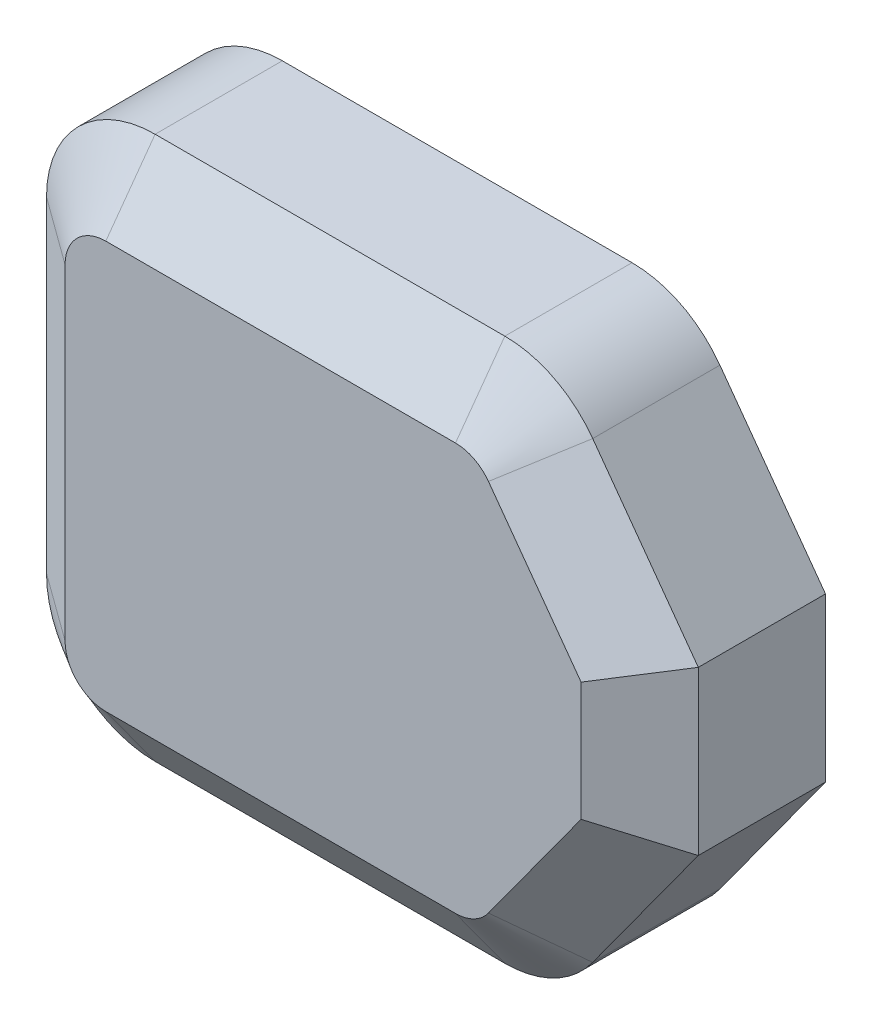
ISO-10303-21;
HEADER;
FILE_DESCRIPTION(('STEP AP214'),'2;1');
FILE_NAME('part.step','',(''),(''),'','','');
FILE_SCHEMA(('AUTOMOTIVE_DESIGN { 1 0 10303 214 1 1 1 1 }'));
ENDSEC;
DATA;
#1=APPLICATION_CONTEXT('core data for automotive mechanical design processes');
#2=APPLICATION_PROTOCOL_DEFINITION('international standard','automotive_design',2000,#1);
#3=PRODUCT_CONTEXT('',#1,'mechanical');
#4=PRODUCT('Part','Part','',(#3));
#5=PRODUCT_RELATED_PRODUCT_CATEGORY('part','',(#4));
#6=PRODUCT_DEFINITION_FORMATION('','',#4);
#7=PRODUCT_DEFINITION_CONTEXT('part definition',#1,'design');
#8=PRODUCT_DEFINITION('design','',#6,#7);
#9=PRODUCT_DEFINITION_SHAPE('','',#8);
#10=(LENGTH_UNIT() NAMED_UNIT(*) SI_UNIT(.MILLI.,.METRE.));
#11=(NAMED_UNIT(*) PLANE_ANGLE_UNIT() SI_UNIT($,.RADIAN.));
#12=(NAMED_UNIT(*) SI_UNIT($,.STERADIAN.) SOLID_ANGLE_UNIT());
#13=UNCERTAINTY_MEASURE_WITH_UNIT(LENGTH_MEASURE(1.E-05),#10,'distance_accuracy_value','');
#14=(GEOMETRIC_REPRESENTATION_CONTEXT(3) GLOBAL_UNCERTAINTY_ASSIGNED_CONTEXT((#13)) GLOBAL_UNIT_ASSIGNED_CONTEXT((#10,
#11,#12)) REPRESENTATION_CONTEXT('',''));
#15=CARTESIAN_POINT('',(0.,0.,0.));
#16=DIRECTION('',(0.,0.,1.));
#17=DIRECTION('',(1.,0.,0.));
#18=AXIS2_PLACEMENT_3D('',#15,#16,#17);
#19=CARTESIAN_POINT('',(0.,0.,13.));
#20=DIRECTION('',(1.,0.,0.));
#21=DIRECTION('',(0.,0.,-1.));
#22=AXIS2_PLACEMENT_3D('',#19,#20,#21);
#23=PLANE('',#22);
#24=DIRECTION('',(0.,0.,-1.));
#25=VECTOR('',#24,1.);
#26=CARTESIAN_POINT('',(0.,8.,13.));
#27=LINE('',#26,#25);
#28=CARTESIAN_POINT('',(0.,8.,0.));
#29=VERTEX_POINT('',#28);
#30=CARTESIAN_POINT('',(0.,8.,9.3672873599732));
#31=VERTEX_POINT('',#30);
#32=EDGE_CURVE('E160',#29,#31,#27,.F.);
#33=ORIENTED_EDGE('',*,*,#32,.T.);
#34=DIRECTION('',(0.,1.,0.));
#35=VECTOR('',#34,1.);
#36=CARTESIAN_POINT('',(0.,0.,9.3672873599732));
#37=LINE('',#36,#35);
#38=CARTESIAN_POINT('',(0.,32.,9.3672873599732));
#39=VERTEX_POINT('',#38);
#40=EDGE_CURVE('E236',#31,#39,#37,.T.);
#41=ORIENTED_EDGE('',*,*,#40,.T.);
#42=DIRECTION('',(0.,0.,-1.));
#43=VECTOR('',#42,1.);
#44=CARTESIAN_POINT('',(0.,32.,13.));
#45=LINE('',#44,#43);
#46=CARTESIAN_POINT('',(0.,32.,0.));
#47=VERTEX_POINT('',#46);
#48=EDGE_CURVE('E164',#39,#47,#45,.T.);
#49=ORIENTED_EDGE('',*,*,#48,.T.);
#50=DIRECTION('',(0.,-1.,0.));
#51=VECTOR('',#50,1.);
#52=CARTESIAN_POINT('',(0.,0.,0.));
#53=LINE('',#52,#51);
#54=EDGE_CURVE('E172',#47,#29,#53,.T.);
#55=ORIENTED_EDGE('',*,*,#54,.T.);
#56=EDGE_LOOP('',(#33,#41,#49,#55));
#57=FACE_BOUND('',#56,.T.);
#58=ADVANCED_FACE('F33',(#57),#23,.F.);
#59=CARTESIAN_POINT('',(0.,0.,13.));
#60=DIRECTION('',(0.,1.,0.));
#61=DIRECTION('',(0.,0.,1.));
#62=AXIS2_PLACEMENT_3D('',#59,#60,#61);
#63=PLANE('',#62);
#64=DIRECTION('',(0.,0.,-1.));
#65=VECTOR('',#64,1.);
#66=CARTESIAN_POINT('',(33.7522010119695,0.,13.));
#67=LINE('',#66,#65);
#68=CARTESIAN_POINT('',(33.7522010119695,0.,0.));
#69=VERTEX_POINT('',#68);
#70=CARTESIAN_POINT('',(33.7522010119695,0.,9.3672873599732));
#71=VERTEX_POINT('',#70);
#72=EDGE_CURVE('E201',#69,#71,#67,.F.);
#73=ORIENTED_EDGE('',*,*,#72,.T.);
#74=DIRECTION('',(-1.,0.,0.));
#75=VECTOR('',#74,1.);
#76=CARTESIAN_POINT('',(0.,0.,9.3672873599732));
#77=LINE('',#76,#75);
#78=CARTESIAN_POINT('',(8.,0.,9.3672873599732));
#79=VERTEX_POINT('',#78);
#80=EDGE_CURVE('E150',#71,#79,#77,.T.);
#81=ORIENTED_EDGE('',*,*,#80,.T.);
#82=DIRECTION('',(0.,0.,-1.));
#83=VECTOR('',#82,1.);
#84=CARTESIAN_POINT('',(8.,0.,13.));
#85=LINE('',#84,#83);
#86=CARTESIAN_POINT('',(8.,0.,0.));
#87=VERTEX_POINT('',#86);
#88=EDGE_CURVE('E142',#79,#87,#85,.T.);
#89=ORIENTED_EDGE('',*,*,#88,.T.);
#90=DIRECTION('',(1.,0.,0.));
#91=VECTOR('',#90,1.);
#92=CARTESIAN_POINT('',(0.,0.,0.));
#93=LINE('',#92,#91);
#94=EDGE_CURVE('E147',#87,#69,#93,.T.);
#95=ORIENTED_EDGE('',*,*,#94,.T.);
#96=EDGE_LOOP('',(#73,#81,#89,#95));
#97=FACE_BOUND('',#96,.T.);
#98=ADVANCED_FACE('F145',(#97),#63,.F.);
#99=CARTESIAN_POINT('',(48.,0.,13.));
#100=DIRECTION('',(-1.,0.,0.));
#101=DIRECTION('',(0.,0.,1.));
#102=AXIS2_PLACEMENT_3D('',#99,#100,#101);
#103=PLANE('',#102);
#104=DIRECTION('',(0.,0.,1.));
#105=VECTOR('',#104,1.);
#106=CARTESIAN_POINT('',(48.,26.,13.));
#107=LINE('',#106,#105);
#108=CARTESIAN_POINT('',(48.,26.,0.));
#109=VERTEX_POINT('',#108);
#110=CARTESIAN_POINT('',(48.,26.,9.3672873599732));
#111=VERTEX_POINT('',#110);
#112=EDGE_CURVE('E185',#109,#111,#107,.T.);
#113=ORIENTED_EDGE('',*,*,#112,.T.);
#114=DIRECTION('',(0.,-1.,0.));
#115=VECTOR('',#114,1.);
#116=CARTESIAN_POINT('',(48.,0.,9.3672873599732));
#117=LINE('',#116,#115);
#118=CARTESIAN_POINT('',(48.,14.0000000000001,9.3672873599732));
#119=VERTEX_POINT('',#118);
#120=EDGE_CURVE('E226',#111,#119,#117,.T.);
#121=ORIENTED_EDGE('',*,*,#120,.T.);
#122=DIRECTION('',(0.,0.,-1.));
#123=VECTOR('',#122,1.);
#124=CARTESIAN_POINT('',(48.,14.0000000000001,13.));
#125=LINE('',#124,#123);
#126=CARTESIAN_POINT('',(48.,14.0000000000001,0.));
#127=VERTEX_POINT('',#126);
#128=EDGE_CURVE('E188',#119,#127,#125,.T.);
#129=ORIENTED_EDGE('',*,*,#128,.T.);
#130=DIRECTION('',(0.,1.,0.));
#131=VECTOR('',#130,1.);
#132=CARTESIAN_POINT('',(48.,0.,0.));
#133=LINE('',#132,#131);
#134=EDGE_CURVE('E171',#127,#109,#133,.T.);
#135=ORIENTED_EDGE('',*,*,#134,.T.);
#136=EDGE_LOOP('',(#113,#121,#129,#135));
#137=FACE_BOUND('',#136,.T.);
#138=ADVANCED_FACE('F310',(#137),#103,.F.);
#139=CARTESIAN_POINT('',(0.,40.,13.));
#140=DIRECTION('',(0.,-1.,0.));
#141=DIRECTION('',(0.,0.,-1.));
#142=AXIS2_PLACEMENT_3D('',#139,#140,#141);
#143=PLANE('',#142);
#144=DIRECTION('',(0.,0.,-1.));
#145=VECTOR('',#144,1.);
#146=CARTESIAN_POINT('',(8.,40.,13.));
#147=LINE('',#146,#145);
#148=CARTESIAN_POINT('',(8.,40.,0.));
#149=VERTEX_POINT('',#148);
#150=CARTESIAN_POINT('',(8.,40.,9.3672873599732));
#151=VERTEX_POINT('',#150);
#152=EDGE_CURVE('E183',#149,#151,#147,.F.);
#153=ORIENTED_EDGE('',*,*,#152,.T.);
#154=DIRECTION('',(1.,0.,0.));
#155=VECTOR('',#154,1.);
#156=CARTESIAN_POINT('',(0.,40.,9.3672873599732));
#157=LINE('',#156,#155);
#158=CARTESIAN_POINT('',(33.7522010119695,40.,9.3672873599732));
#159=VERTEX_POINT('',#158);
#160=EDGE_CURVE('E57',#151,#159,#157,.T.);
#161=ORIENTED_EDGE('',*,*,#160,.T.);
#162=DIRECTION('',(0.,0.,1.));
#163=VECTOR('',#162,1.);
#164=CARTESIAN_POINT('',(33.7522010119695,40.,0.));
#165=LINE('',#164,#163);
#166=CARTESIAN_POINT('',(33.7522010119695,40.,0.));
#167=VERTEX_POINT('',#166);
#168=EDGE_CURVE('E194',#159,#167,#165,.F.);
#169=ORIENTED_EDGE('',*,*,#168,.T.);
#170=DIRECTION('',(-1.,0.,0.));
#171=VECTOR('',#170,1.);
#172=CARTESIAN_POINT('',(0.,40.,0.));
#173=LINE('',#172,#171);
#174=EDGE_CURVE('E154',#167,#149,#173,.T.);
#175=ORIENTED_EDGE('',*,*,#174,.T.);
#176=EDGE_LOOP('',(#153,#161,#169,#175));
#177=FACE_BOUND('',#176,.T.);
#178=ADVANCED_FACE('F286',(#177),#143,.F.);
#179=CARTESIAN_POINT('',(0.,0.,13.));
#180=DIRECTION('',(0.,0.,-1.));
#181=DIRECTION('',(-1.,0.,0.));
#182=AXIS2_PLACEMENT_3D('',#179,#180,#181);
#183=PLANE('',#182);
#184=DIRECTION('',(0.587785252292472,0.809016994374949,0.));
#185=VECTOR('',#184,1.);
#186=CARTESIAN_POINT('',(43.9549150281252,16.9389262614624,13.));
#187=LINE('',#186,#185);
#188=CARTESIAN_POINT('',(36.1792519950943,6.23664424312258,13.));
#189=VERTEX_POINT('',#188);
#190=CARTESIAN_POINT('',(43.,15.6245984811646,13.));
#191=VERTEX_POINT('',#190);
#192=EDGE_CURVE('E221',#189,#191,#187,.T.);
#193=ORIENTED_EDGE('',*,*,#192,.T.);
#194=DIRECTION('',(0.,1.,0.));
#195=VECTOR('',#194,1.);
#196=CARTESIAN_POINT('',(43.,0.,13.));
#197=LINE('',#196,#195);
#198=CARTESIAN_POINT('',(43.,24.3754015188354,13.));
#199=VERTEX_POINT('',#198);
#200=EDGE_CURVE('E223',#191,#199,#197,.T.);
#201=ORIENTED_EDGE('',*,*,#200,.T.);
#202=DIRECTION('',(-0.587785252292472,0.809016994374948,0.));
#203=VECTOR('',#202,1.);
#204=CARTESIAN_POINT('',(36.1792519950943,33.7633557568774,13.));
#205=LINE('',#204,#203);
#206=CARTESIAN_POINT('',(36.1792519950943,33.7633557568774,13.));
#207=VERTEX_POINT('',#206);
#208=EDGE_CURVE('E205',#199,#207,#205,.T.);
#209=ORIENTED_EDGE('',*,*,#208,.T.);
#210=CARTESIAN_POINT('',(33.7522010119695,32.,13.));
#211=DIRECTION('',(0.,0.,-1.));
#212=DIRECTION('',(-1.,0.,0.));
#213=AXIS2_PLACEMENT_3D('',#210,#211,#212);
#214=CIRCLE('',#213,2.99999999999999);
#215=CARTESIAN_POINT('',(33.7522010119695,35.,13.));
#216=VERTEX_POINT('',#215);
#217=EDGE_CURVE('E207',#207,#216,#214,.F.);
#218=ORIENTED_EDGE('',*,*,#217,.T.);
#219=DIRECTION('',(-1.,0.,0.));
#220=VECTOR('',#219,1.);
#221=CARTESIAN_POINT('',(0.,35.,13.));
#222=LINE('',#221,#220);
#223=CARTESIAN_POINT('',(8.,35.,13.));
#224=VERTEX_POINT('',#223);
#225=EDGE_CURVE('E209',#216,#224,#222,.T.);
#226=ORIENTED_EDGE('',*,*,#225,.T.);
#227=CARTESIAN_POINT('',(8.,32.,13.));
#228=DIRECTION('',(0.,0.,-1.));
#229=DIRECTION('',(-1.,0.,0.));
#230=AXIS2_PLACEMENT_3D('',#227,#228,#229);
#231=CIRCLE('',#230,2.99999999999999);
#232=CARTESIAN_POINT('',(5.00000000000001,32.,13.));
#233=VERTEX_POINT('',#232);
#234=EDGE_CURVE('E211',#224,#233,#231,.F.);
#235=ORIENTED_EDGE('',*,*,#234,.T.);
#236=DIRECTION('',(0.,-1.,0.));
#237=VECTOR('',#236,1.);
#238=CARTESIAN_POINT('',(5.00000000000001,0.,13.));
#239=LINE('',#238,#237);
#240=CARTESIAN_POINT('',(5.00000000000001,8.,13.));
#241=VERTEX_POINT('',#240);
#242=EDGE_CURVE('E213',#233,#241,#239,.T.);
#243=ORIENTED_EDGE('',*,*,#242,.T.);
#244=CARTESIAN_POINT('',(8.,8.,13.));
#245=DIRECTION('',(0.,0.,-1.));
#246=DIRECTION('',(-1.,0.,0.));
#247=AXIS2_PLACEMENT_3D('',#244,#245,#246);
#248=CIRCLE('',#247,2.99999999999999);
#249=CARTESIAN_POINT('',(8.,5.00000000000001,13.));
#250=VERTEX_POINT('',#249);
#251=EDGE_CURVE('E215',#241,#250,#248,.F.);
#252=ORIENTED_EDGE('',*,*,#251,.T.);
#253=DIRECTION('',(1.,0.,0.));
#254=VECTOR('',#253,1.);
#255=CARTESIAN_POINT('',(0.,5.00000000000001,13.));
#256=LINE('',#255,#254);
#257=CARTESIAN_POINT('',(33.7522010119695,5.00000000000001,13.));
#258=VERTEX_POINT('',#257);
#259=EDGE_CURVE('E217',#250,#258,#256,.T.);
#260=ORIENTED_EDGE('',*,*,#259,.T.);
#261=CARTESIAN_POINT('',(33.7522010119695,8.,13.));
#262=DIRECTION('',(0.,0.,-1.));
#263=DIRECTION('',(-1.,0.,0.));
#264=AXIS2_PLACEMENT_3D('',#261,#262,#263);
#265=CIRCLE('',#264,2.99999999999999);
#266=EDGE_CURVE('E219',#258,#189,#265,.F.);
#267=ORIENTED_EDGE('',*,*,#266,.T.);
#268=EDGE_LOOP('',(#193,#201,#209,#218,#226,#235,#243,#252,#260,#267));
#269=FACE_BOUND('',#268,.T.);
#270=ADVANCED_FACE('F329',(#269),#183,.F.);
#271=CARTESIAN_POINT('',(0.,0.,0.));
#272=DIRECTION('',(0.,0.,-1.));
#273=DIRECTION('',(-1.,0.,0.));
#274=AXIS2_PLACEMENT_3D('',#271,#272,#273);
#275=PLANE('',#274);
#276=ORIENTED_EDGE('',*,*,#174,.F.);
#277=CARTESIAN_POINT('',(33.7522010119695,32.,0.));
#278=DIRECTION('',(0.,0.,-1.));
#279=DIRECTION('',(-1.,0.,0.));
#280=AXIS2_PLACEMENT_3D('',#277,#278,#279);
#281=CIRCLE('',#280,8.);
#282=CARTESIAN_POINT('',(40.2243369669691,36.7022820183398,0.));
#283=VERTEX_POINT('',#282);
#284=EDGE_CURVE('E197',#167,#283,#281,.T.);
#285=ORIENTED_EDGE('',*,*,#284,.T.);
#286=DIRECTION('',(-0.587785252292472,0.809016994374948,0.));
#287=VECTOR('',#286,1.);
#288=CARTESIAN_POINT('',(43.7801425768358,31.8081354642093,0.));
#289=LINE('',#288,#287);
#290=EDGE_CURVE('E190',#283,#109,#289,.F.);
#291=ORIENTED_EDGE('',*,*,#290,.T.);
#292=ORIENTED_EDGE('',*,*,#134,.F.);
#293=DIRECTION('',(0.587785252292472,0.809016994374949,0.));
#294=VECTOR('',#293,1.);
#295=CARTESIAN_POINT('',(24.7590122509327,-17.9884753517083,0.));
#296=LINE('',#295,#294);
#297=CARTESIAN_POINT('',(40.2243369669691,3.29771798166023,0.));
#298=VERTEX_POINT('',#297);
#299=EDGE_CURVE('E192',#127,#298,#296,.F.);
#300=ORIENTED_EDGE('',*,*,#299,.T.);
#301=CARTESIAN_POINT('',(33.7522010119695,8.,0.));
#302=DIRECTION('',(0.,0.,-1.));
#303=DIRECTION('',(-1.,0.,0.));
#304=AXIS2_PLACEMENT_3D('',#301,#302,#303);
#305=CIRCLE('',#304,8.);
#306=EDGE_CURVE('E170',#298,#69,#305,.T.);
#307=ORIENTED_EDGE('',*,*,#306,.T.);
#308=ORIENTED_EDGE('',*,*,#94,.F.);
#309=CARTESIAN_POINT('',(8.,8.,0.));
#310=DIRECTION('',(0.,0.,-1.));
#311=DIRECTION('',(-1.,0.,0.));
#312=AXIS2_PLACEMENT_3D('',#309,#310,#311);
#313=CIRCLE('',#312,8.);
#314=EDGE_CURVE('E157',#87,#29,#313,.T.);
#315=ORIENTED_EDGE('',*,*,#314,.T.);
#316=ORIENTED_EDGE('',*,*,#54,.F.);
#317=CARTESIAN_POINT('',(8.,32.,0.));
#318=DIRECTION('',(0.,0.,-1.));
#319=DIRECTION('',(-1.,0.,0.));
#320=AXIS2_PLACEMENT_3D('',#317,#318,#319);
#321=CIRCLE('',#320,8.);
#322=EDGE_CURVE('E153',#47,#149,#321,.T.);
#323=ORIENTED_EDGE('',*,*,#322,.T.);
#324=EDGE_LOOP('',(#276,#285,#291,#292,#300,#307,#308,#315,#316,#323));
#325=FACE_BOUND('',#324,.T.);
#326=ADVANCED_FACE('F167',(#325),#275,.T.);
#327=CARTESIAN_POINT('',(8.,8.,13.));
#328=DIRECTION('',(0.,0.,-1.));
#329=DIRECTION('',(-1.,0.,0.));
#330=AXIS2_PLACEMENT_3D('',#327,#328,#329);
#331=CYLINDRICAL_SURFACE('',#330,8.);
#332=ORIENTED_EDGE('',*,*,#88,.F.);
#333=CARTESIAN_POINT('',(8.,8.,9.3672873599732));
#334=DIRECTION('',(0.,0.,-1.));
#335=DIRECTION('',(-1.,0.,0.));
#336=AXIS2_PLACEMENT_3D('',#333,#334,#335);
#337=CIRCLE('',#336,8.);
#338=EDGE_CURVE('E234',#79,#31,#337,.T.);
#339=ORIENTED_EDGE('',*,*,#338,.T.);
#340=ORIENTED_EDGE('',*,*,#32,.F.);
#341=ORIENTED_EDGE('',*,*,#314,.F.);
#342=EDGE_LOOP('',(#332,#339,#340,#341));
#343=FACE_BOUND('',#342,.T.);
#344=ADVANCED_FACE('F158',(#343),#331,.T.);
#345=CARTESIAN_POINT('',(8.,32.,13.));
#346=DIRECTION('',(0.,0.,-1.));
#347=DIRECTION('',(-1.,0.,0.));
#348=AXIS2_PLACEMENT_3D('',#345,#346,#347);
#349=CYLINDRICAL_SURFACE('',#348,8.);
#350=ORIENTED_EDGE('',*,*,#48,.F.);
#351=CARTESIAN_POINT('',(8.,32.,9.3672873599732));
#352=DIRECTION('',(0.,0.,-1.));
#353=DIRECTION('',(-1.,0.,0.));
#354=AXIS2_PLACEMENT_3D('',#351,#352,#353);
#355=CIRCLE('',#354,8.);
#356=EDGE_CURVE('E238',#39,#151,#355,.T.);
#357=ORIENTED_EDGE('',*,*,#356,.T.);
#358=ORIENTED_EDGE('',*,*,#152,.F.);
#359=ORIENTED_EDGE('',*,*,#322,.F.);
#360=EDGE_LOOP('',(#350,#357,#358,#359));
#361=FACE_BOUND('',#360,.T.);
#362=ADVANCED_FACE('F282',(#361),#349,.T.);
#363=CARTESIAN_POINT('',(48.,14.0000000000001,13.));
#364=DIRECTION('',(-0.809016994374949,0.587785252292472,0.));
#365=DIRECTION('',(0.,0.,-1.));
#366=AXIS2_PLACEMENT_3D('',#363,#364,#365);
#367=PLANE('',#366);
#368=ORIENTED_EDGE('',*,*,#128,.F.);
#369=DIRECTION('',(0.587785252292472,0.809016994374949,0.));
#370=VECTOR('',#369,1.);
#371=CARTESIAN_POINT('',(40.2243369669691,3.29771798166022,9.3672873599732));
#372=LINE('',#371,#370);
#373=CARTESIAN_POINT('',(40.2243369669691,3.29771798166023,9.3672873599732));
#374=VERTEX_POINT('',#373);
#375=EDGE_CURVE('E229',#119,#374,#372,.F.);
#376=ORIENTED_EDGE('',*,*,#375,.T.);
#377=DIRECTION('',(0.,0.,1.));
#378=VECTOR('',#377,1.);
#379=CARTESIAN_POINT('',(40.2243369669691,3.29771798166023,0.));
#380=LINE('',#379,#378);
#381=EDGE_CURVE('E203',#374,#298,#380,.F.);
#382=ORIENTED_EDGE('',*,*,#381,.T.);
#383=ORIENTED_EDGE('',*,*,#299,.F.);
#384=EDGE_LOOP('',(#368,#376,#382,#383));
#385=FACE_BOUND('',#384,.T.);
#386=ADVANCED_FACE('F313',(#385),#367,.F.);
#387=CARTESIAN_POINT('',(37.828404607925,40.,13.));
#388=DIRECTION('',(-0.809016994374948,-0.587785252292472,0.));
#389=DIRECTION('',(0.,0.,-1.));
#390=AXIS2_PLACEMENT_3D('',#387,#388,#389);
#391=PLANE('',#390);
#392=DIRECTION('',(0.,0.,-1.));
#393=VECTOR('',#392,1.);
#394=CARTESIAN_POINT('',(40.2243369669691,36.7022820183398,13.));
#395=LINE('',#394,#393);
#396=CARTESIAN_POINT('',(40.2243369669691,36.7022820183398,9.3672873599732));
#397=VERTEX_POINT('',#396);
#398=EDGE_CURVE('E199',#283,#397,#395,.F.);
#399=ORIENTED_EDGE('',*,*,#398,.T.);
#400=DIRECTION('',(-0.587785252292472,0.809016994374948,0.));
#401=VECTOR('',#400,1.);
#402=CARTESIAN_POINT('',(48.,26.,9.3672873599732));
#403=LINE('',#402,#401);
#404=EDGE_CURVE('E11',#397,#111,#403,.F.);
#405=ORIENTED_EDGE('',*,*,#404,.T.);
#406=ORIENTED_EDGE('',*,*,#112,.F.);
#407=ORIENTED_EDGE('',*,*,#290,.F.);
#408=EDGE_LOOP('',(#399,#405,#406,#407));
#409=FACE_BOUND('',#408,.T.);
#410=ADVANCED_FACE('F292',(#409),#391,.F.);
#411=CARTESIAN_POINT('',(33.7522010119695,32.,13.));
#412=DIRECTION('',(0.,0.,-1.));
#413=DIRECTION('',(-1.,0.,0.));
#414=AXIS2_PLACEMENT_3D('',#411,#412,#413);
#415=CYLINDRICAL_SURFACE('',#414,8.);
#416=ORIENTED_EDGE('',*,*,#168,.F.);
#417=CARTESIAN_POINT('',(33.7522010119695,32.,9.3672873599732));
#418=DIRECTION('',(0.,0.,-1.));
#419=DIRECTION('',(-1.,0.,0.));
#420=AXIS2_PLACEMENT_3D('',#417,#418,#419);
#421=CIRCLE('',#420,8.);
#422=EDGE_CURVE('E42',#159,#397,#421,.T.);
#423=ORIENTED_EDGE('',*,*,#422,.T.);
#424=ORIENTED_EDGE('',*,*,#398,.F.);
#425=ORIENTED_EDGE('',*,*,#284,.F.);
#426=EDGE_LOOP('',(#416,#423,#424,#425));
#427=FACE_BOUND('',#426,.T.);
#428=ADVANCED_FACE('F289',(#427),#415,.T.);
#429=CARTESIAN_POINT('',(33.7522010119695,8.,13.));
#430=DIRECTION('',(0.,0.,1.));
#431=DIRECTION('',(1.,0.,0.));
#432=AXIS2_PLACEMENT_3D('',#429,#430,#431);
#433=CYLINDRICAL_SURFACE('',#432,8.);
#434=ORIENTED_EDGE('',*,*,#381,.F.);
#435=CARTESIAN_POINT('',(33.7522010119695,8.,9.3672873599732));
#436=DIRECTION('',(0.,0.,-1.));
#437=DIRECTION('',(-1.,0.,0.));
#438=AXIS2_PLACEMENT_3D('',#435,#436,#437);
#439=CIRCLE('',#438,8.);
#440=EDGE_CURVE('E231',#374,#71,#439,.T.);
#441=ORIENTED_EDGE('',*,*,#440,.T.);
#442=ORIENTED_EDGE('',*,*,#72,.F.);
#443=ORIENTED_EDGE('',*,*,#306,.F.);
#444=EDGE_LOOP('',(#434,#441,#442,#443));
#445=FACE_BOUND('',#444,.T.);
#446=ADVANCED_FACE('F317',(#445),#433,.T.);
#447=CARTESIAN_POINT('',(5.00000000000001,0.,13.));
#448=DIRECTION('',(0.587785252292472,0.,-0.809016994374948));
#449=DIRECTION('',(0.,-1.,0.));
#450=AXIS2_PLACEMENT_3D('',#447,#448,#449);
#451=PLANE('',#450);
#452=DIRECTION('',(0.809016994374948,0.,0.587785252292472));
#453=VECTOR('',#452,1.);
#454=CARTESIAN_POINT('',(0.,32.,9.3672873599732));
#455=LINE('',#454,#453);
#456=EDGE_CURVE('E263',#39,#233,#455,.T.);
#457=ORIENTED_EDGE('',*,*,#456,.F.);
#458=ORIENTED_EDGE('',*,*,#40,.F.);
#459=DIRECTION('',(-0.809016994374948,0.,-0.587785252292472));
#460=VECTOR('',#459,1.);
#461=CARTESIAN_POINT('',(5.00000000000001,8.,13.));
#462=LINE('',#461,#460);
#463=EDGE_CURVE('E37',#241,#31,#462,.T.);
#464=ORIENTED_EDGE('',*,*,#463,.F.);
#465=ORIENTED_EDGE('',*,*,#242,.F.);
#466=EDGE_LOOP('',(#457,#458,#464,#465));
#467=FACE_BOUND('',#466,.T.);
#468=ADVANCED_FACE('F35',(#467),#451,.F.);
#469=CARTESIAN_POINT('',(8.,8.,13.));
#470=DIRECTION('',(0.,0.,-1.));
#471=DIRECTION('',(-1.,0.,0.));
#472=AXIS2_PLACEMENT_3D('',#469,#470,#471);
#473=CONICAL_SURFACE('',#472,2.99999999999999,0.942477796076939);
#474=ORIENTED_EDGE('',*,*,#463,.T.);
#475=ORIENTED_EDGE('',*,*,#338,.F.);
#476=DIRECTION('',(0.,-0.809016994374948,-0.587785252292472));
#477=VECTOR('',#476,1.);
#478=CARTESIAN_POINT('',(8.,5.00000000000001,13.));
#479=LINE('',#478,#477);
#480=EDGE_CURVE('E261',#250,#79,#479,.T.);
#481=ORIENTED_EDGE('',*,*,#480,.F.);
#482=ORIENTED_EDGE('',*,*,#251,.F.);
#483=EDGE_LOOP('',(#474,#475,#481,#482));
#484=FACE_BOUND('',#483,.T.);
#485=ADVANCED_FACE('F273',(#484),#473,.T.);
#486=CARTESIAN_POINT('',(8.,32.,13.));
#487=DIRECTION('',(0.,0.,-1.));
#488=DIRECTION('',(-1.,0.,0.));
#489=AXIS2_PLACEMENT_3D('',#486,#487,#488);
#490=CONICAL_SURFACE('',#489,2.99999999999999,0.942477796076939);
#491=ORIENTED_EDGE('',*,*,#456,.T.);
#492=ORIENTED_EDGE('',*,*,#234,.F.);
#493=DIRECTION('',(0.,-0.809016994374949,0.587785252292472));
#494=VECTOR('',#493,1.);
#495=CARTESIAN_POINT('',(8.,40.,9.3672873599732));
#496=LINE('',#495,#494);
#497=EDGE_CURVE('E258',#151,#224,#496,.T.);
#498=ORIENTED_EDGE('',*,*,#497,.F.);
#499=ORIENTED_EDGE('',*,*,#356,.F.);
#500=EDGE_LOOP('',(#491,#492,#498,#499));
#501=FACE_BOUND('',#500,.T.);
#502=ADVANCED_FACE('F331',(#501),#490,.T.);
#503=CARTESIAN_POINT('',(0.,5.00000000000001,13.));
#504=DIRECTION('',(0.,0.587785252292472,-0.809016994374948));
#505=DIRECTION('',(1.,0.,0.));
#506=AXIS2_PLACEMENT_3D('',#503,#504,#505);
#507=PLANE('',#506);
#508=ORIENTED_EDGE('',*,*,#480,.T.);
#509=ORIENTED_EDGE('',*,*,#80,.F.);
#510=DIRECTION('',(0.,-0.809016994374948,-0.587785252292472));
#511=VECTOR('',#510,1.);
#512=CARTESIAN_POINT('',(33.7522010119695,5.00000000000001,13.));
#513=LINE('',#512,#511);
#514=EDGE_CURVE('E255',#258,#71,#513,.T.);
#515=ORIENTED_EDGE('',*,*,#514,.F.);
#516=ORIENTED_EDGE('',*,*,#259,.F.);
#517=EDGE_LOOP('',(#508,#509,#515,#516));
#518=FACE_BOUND('',#517,.T.);
#519=ADVANCED_FACE('F321',(#518),#507,.F.);
#520=CARTESIAN_POINT('',(0.,35.,13.));
#521=DIRECTION('',(0.,-0.587785252292472,-0.809016994374949));
#522=DIRECTION('',(-1.,0.,0.));
#523=AXIS2_PLACEMENT_3D('',#520,#521,#522);
#524=PLANE('',#523);
#525=ORIENTED_EDGE('',*,*,#497,.T.);
#526=ORIENTED_EDGE('',*,*,#225,.F.);
#527=DIRECTION('',(0.,-0.809016994374949,0.587785252292472));
#528=VECTOR('',#527,1.);
#529=CARTESIAN_POINT('',(33.7522010119695,40.,9.3672873599732));
#530=LINE('',#529,#528);
#531=EDGE_CURVE('E252',#159,#216,#530,.T.);
#532=ORIENTED_EDGE('',*,*,#531,.F.);
#533=ORIENTED_EDGE('',*,*,#160,.F.);
#534=EDGE_LOOP('',(#525,#526,#532,#533));
#535=FACE_BOUND('',#534,.T.);
#536=ADVANCED_FACE('F333',(#535),#524,.F.);
#537=CARTESIAN_POINT('',(33.7522010119695,8.,13.));
#538=DIRECTION('',(0.,0.,-1.));
#539=DIRECTION('',(-1.,0.,0.));
#540=AXIS2_PLACEMENT_3D('',#537,#538,#539);
#541=CONICAL_SURFACE('',#540,2.99999999999999,0.942477796076939);
#542=ORIENTED_EDGE('',*,*,#514,.T.);
#543=ORIENTED_EDGE('',*,*,#440,.F.);
#544=DIRECTION('',(0.654508497187475,-0.475528258147576,-0.587785252292472));
#545=VECTOR('',#544,1.);
#546=CARTESIAN_POINT('',(36.1792519950943,6.23664424312258,13.));
#547=LINE('',#546,#545);
#548=EDGE_CURVE('E249',#189,#374,#547,.T.);
#549=ORIENTED_EDGE('',*,*,#548,.F.);
#550=ORIENTED_EDGE('',*,*,#266,.F.);
#551=EDGE_LOOP('',(#542,#543,#549,#550));
#552=FACE_BOUND('',#551,.T.);
#553=ADVANCED_FACE('F325',(#552),#541,.T.);
#554=CARTESIAN_POINT('',(33.7522010119695,32.,13.));
#555=DIRECTION('',(0.,0.,-1.));
#556=DIRECTION('',(-1.,0.,0.));
#557=AXIS2_PLACEMENT_3D('',#554,#555,#556);
#558=CONICAL_SURFACE('',#557,2.99999999999999,0.94247779607694);
#559=ORIENTED_EDGE('',*,*,#531,.T.);
#560=ORIENTED_EDGE('',*,*,#217,.F.);
#561=DIRECTION('',(-0.654508497187475,-0.475528258147576,0.587785252292472));
#562=VECTOR('',#561,1.);
#563=CARTESIAN_POINT('',(40.2243369669691,36.7022820183398,9.3672873599732));
#564=LINE('',#563,#562);
#565=EDGE_CURVE('E246',#397,#207,#564,.T.);
#566=ORIENTED_EDGE('',*,*,#565,.F.);
#567=ORIENTED_EDGE('',*,*,#422,.F.);
#568=EDGE_LOOP('',(#559,#560,#566,#567));
#569=FACE_BOUND('',#568,.T.);
#570=ADVANCED_FACE('F297',(#569),#558,.T.);
#571=CARTESIAN_POINT('',(20.713927279058,-15.0495490902459,13.));
#572=DIRECTION('',(-0.475528258147576,0.345491502812524,-0.809016994374949));
#573=DIRECTION('',(0.587785252292472,0.809016994374949,0.));
#574=AXIS2_PLACEMENT_3D('',#571,#572,#573);
#575=PLANE('',#574);
#576=ORIENTED_EDGE('',*,*,#548,.T.);
#577=ORIENTED_EDGE('',*,*,#375,.F.);
#578=DIRECTION('',(-0.782436001431816,0.254228867906917,0.568473030482677));
#579=VECTOR('',#578,1.);
#580=CARTESIAN_POINT('',(35.4579649469375,18.0751542195836,18.479609213757));
#581=LINE('',#580,#579);
#582=EDGE_CURVE('E244',#191,#119,#581,.F.);
#583=ORIENTED_EDGE('',*,*,#582,.F.);
#584=ORIENTED_EDGE('',*,*,#192,.F.);
#585=EDGE_LOOP('',(#576,#577,#583,#584));
#586=FACE_BOUND('',#585,.T.);
#587=ADVANCED_FACE('F366',(#586),#575,.F.);
#588=CARTESIAN_POINT('',(39.735057604961,28.8692092027469,13.));
#589=DIRECTION('',(-0.475528258147575,-0.345491502812524,-0.809016994374949));
#590=DIRECTION('',(-0.587785252292472,0.809016994374948,0.));
#591=AXIS2_PLACEMENT_3D('',#588,#589,#590);
#592=PLANE('',#591);
#593=ORIENTED_EDGE('',*,*,#565,.T.);
#594=ORIENTED_EDGE('',*,*,#208,.F.);
#595=DIRECTION('',(0.782436001431816,0.254228867906919,-0.568473030482676));
#596=VECTOR('',#595,1.);
#597=CARTESIAN_POINT('',(41.8950807844006,24.016391502941,13.8027708001433));
#598=LINE('',#597,#596);
#599=EDGE_CURVE('E242',#111,#199,#598,.F.);
#600=ORIENTED_EDGE('',*,*,#599,.F.);
#601=ORIENTED_EDGE('',*,*,#404,.F.);
#602=EDGE_LOOP('',(#593,#594,#600,#601));
#603=FACE_BOUND('',#602,.T.);
#604=ADVANCED_FACE('F301',(#603),#592,.F.);
#605=CARTESIAN_POINT('',(43.,0.,13.));
#606=DIRECTION('',(-0.587785252292472,0.,-0.809016994374948));
#607=DIRECTION('',(0.,1.,0.));
#608=AXIS2_PLACEMENT_3D('',#605,#606,#607);
#609=PLANE('',#608);
#610=ORIENTED_EDGE('',*,*,#582,.T.);
#611=ORIENTED_EDGE('',*,*,#120,.F.);
#612=ORIENTED_EDGE('',*,*,#599,.T.);
#613=ORIENTED_EDGE('',*,*,#200,.F.);
#614=EDGE_LOOP('',(#610,#611,#612,#613));
#615=FACE_BOUND('',#614,.T.);
#616=ADVANCED_FACE('F305',(#615),#609,.F.);
#617=CLOSED_SHELL('',(#58,#98,#138,#178,#270,#326,#344,#362,#386,#410,#428,#446,#468,#485,#502,
#519,#536,#553,#570,#587,#604,#616));
#618=MANIFOLD_SOLID_BREP('B2',#617);
#619=ADVANCED_BREP_SHAPE_REPRESENTATION('',(#18,#618),#14);
#620=SHAPE_DEFINITION_REPRESENTATION(#9,#619);
ENDSEC;
END-ISO-10303-21;
